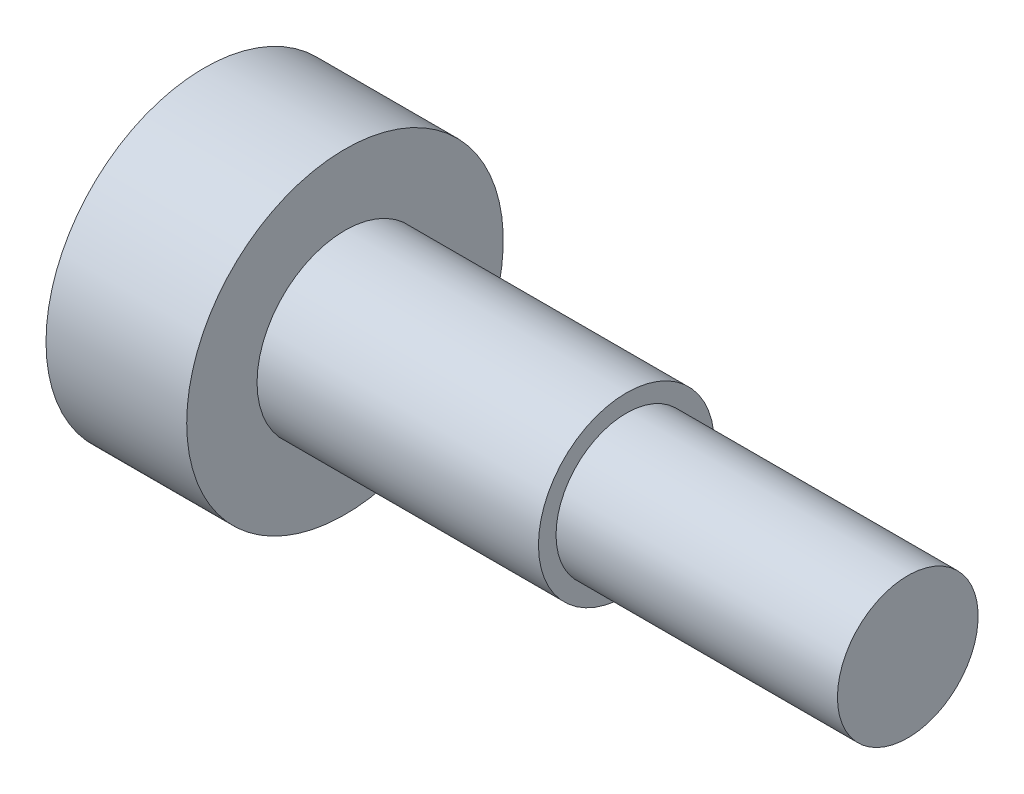
ISO-10303-21;
HEADER;
FILE_DESCRIPTION(('STEP AP214'),'2;1');
FILE_NAME('part.step','',(''),(''),'','','');
FILE_SCHEMA(('AUTOMOTIVE_DESIGN { 1 0 10303 214 1 1 1 1 }'));
ENDSEC;
DATA;
#1=APPLICATION_CONTEXT('core data for automotive mechanical design processes');
#2=APPLICATION_PROTOCOL_DEFINITION('international standard','automotive_design',2000,#1);
#3=PRODUCT_CONTEXT('',#1,'mechanical');
#4=PRODUCT('Part','Part','',(#3));
#5=PRODUCT_RELATED_PRODUCT_CATEGORY('part','',(#4));
#6=PRODUCT_DEFINITION_FORMATION('','',#4);
#7=PRODUCT_DEFINITION_CONTEXT('part definition',#1,'design');
#8=PRODUCT_DEFINITION('design','',#6,#7);
#9=PRODUCT_DEFINITION_SHAPE('','',#8);
#10=(LENGTH_UNIT() NAMED_UNIT(*) SI_UNIT(.MILLI.,.METRE.));
#11=(NAMED_UNIT(*) PLANE_ANGLE_UNIT() SI_UNIT($,.RADIAN.));
#12=(NAMED_UNIT(*) SI_UNIT($,.STERADIAN.) SOLID_ANGLE_UNIT());
#13=UNCERTAINTY_MEASURE_WITH_UNIT(LENGTH_MEASURE(1.E-05),#10,'distance_accuracy_value','');
#14=(GEOMETRIC_REPRESENTATION_CONTEXT(3) GLOBAL_UNCERTAINTY_ASSIGNED_CONTEXT((#13)) GLOBAL_UNIT_ASSIGNED_CONTEXT((#10,
#11,#12)) REPRESENTATION_CONTEXT('',''));
#15=CARTESIAN_POINT('',(0.,0.,0.));
#16=DIRECTION('',(0.,0.,1.));
#17=DIRECTION('',(1.,0.,0.));
#18=AXIS2_PLACEMENT_3D('',#15,#16,#17);
#19=CARTESIAN_POINT('',(4.,4.5,0.));
#20=DIRECTION('',(-1.,0.,0.));
#21=DIRECTION('',(0.,0.,1.));
#22=AXIS2_PLACEMENT_3D('',#19,#20,#21);
#23=PLANE('',#22);
#24=CARTESIAN_POINT('',(4.,0.,0.));
#25=DIRECTION('',(-1.,0.,0.));
#26=DIRECTION('',(0.,0.,1.));
#27=AXIS2_PLACEMENT_3D('',#24,#25,#26);
#28=CIRCLE('',#27,4.5);
#29=CARTESIAN_POINT('',(4.,0.,4.5));
#30=VERTEX_POINT('',#29);
#31=EDGE_CURVE('E150',#30,#30,#28,.T.);
#32=ORIENTED_EDGE('',*,*,#31,.F.);
#33=EDGE_LOOP('',(#32));
#34=FACE_BOUND('',#33,.T.);
#35=CARTESIAN_POINT('',(4.,0.,0.));
#36=DIRECTION('',(-1.,0.,0.));
#37=DIRECTION('',(0.,0.,1.));
#38=AXIS2_PLACEMENT_3D('',#35,#36,#37);
#39=CIRCLE('',#38,2.5);
#40=CARTESIAN_POINT('',(4.,0.,2.5));
#41=VERTEX_POINT('',#40);
#42=EDGE_CURVE('E11',#41,#41,#39,.T.);
#43=ORIENTED_EDGE('',*,*,#42,.T.);
#44=EDGE_LOOP('',(#43));
#45=FACE_BOUND('',#44,.T.);
#46=ADVANCED_FACE('F49',(#34,#45),#23,.F.);
#47=CARTESIAN_POINT('',(-20.,0.,0.));
#48=DIRECTION('',(-1.,0.,0.));
#49=DIRECTION('',(0.,0.,1.));
#50=AXIS2_PLACEMENT_3D('',#47,#48,#49);
#51=CYLINDRICAL_SURFACE('',#50,2.5);
#52=ORIENTED_EDGE('',*,*,#42,.F.);
#53=EDGE_LOOP('',(#52));
#54=FACE_BOUND('',#53,.T.);
#55=CARTESIAN_POINT('',(12.,0.,0.));
#56=DIRECTION('',(-1.,0.,0.));
#57=DIRECTION('',(0.,0.,1.));
#58=AXIS2_PLACEMENT_3D('',#55,#56,#57);
#59=CIRCLE('',#58,2.5);
#60=CARTESIAN_POINT('',(12.,0.,2.5));
#61=VERTEX_POINT('',#60);
#62=EDGE_CURVE('E56',#61,#61,#59,.T.);
#63=ORIENTED_EDGE('',*,*,#62,.T.);
#64=EDGE_LOOP('',(#63));
#65=FACE_BOUND('',#64,.T.);
#66=ADVANCED_FACE('F169',(#54,#65),#51,.T.);
#67=CARTESIAN_POINT('',(12.,2.5,0.));
#68=DIRECTION('',(-1.,0.,0.));
#69=DIRECTION('',(0.,0.,1.));
#70=AXIS2_PLACEMENT_3D('',#67,#68,#69);
#71=PLANE('',#70);
#72=ORIENTED_EDGE('',*,*,#62,.F.);
#73=EDGE_LOOP('',(#72));
#74=FACE_BOUND('',#73,.T.);
#75=CARTESIAN_POINT('',(12.,0.,0.));
#76=DIRECTION('',(-1.,0.,0.));
#77=DIRECTION('',(0.,0.,1.));
#78=AXIS2_PLACEMENT_3D('',#75,#76,#77);
#79=CIRCLE('',#78,2.);
#80=CARTESIAN_POINT('',(12.,0.,2.));
#81=VERTEX_POINT('',#80);
#82=EDGE_CURVE('E164',#81,#81,#79,.T.);
#83=ORIENTED_EDGE('',*,*,#82,.T.);
#84=EDGE_LOOP('',(#83));
#85=FACE_BOUND('',#84,.T.);
#86=ADVANCED_FACE('F171',(#74,#85),#71,.F.);
#87=CARTESIAN_POINT('',(-20.,0.,0.));
#88=DIRECTION('',(-1.,0.,0.));
#89=DIRECTION('',(0.,0.,1.));
#90=AXIS2_PLACEMENT_3D('',#87,#88,#89);
#91=CYLINDRICAL_SURFACE('',#90,2.);
#92=ORIENTED_EDGE('',*,*,#82,.F.);
#93=EDGE_LOOP('',(#92));
#94=FACE_BOUND('',#93,.T.);
#95=CARTESIAN_POINT('',(20.,0.,0.));
#96=DIRECTION('',(-1.,0.,0.));
#97=DIRECTION('',(0.,0.,1.));
#98=AXIS2_PLACEMENT_3D('',#95,#96,#97);
#99=CIRCLE('',#98,2.);
#100=CARTESIAN_POINT('',(20.,0.,2.));
#101=VERTEX_POINT('',#100);
#102=EDGE_CURVE('E161',#101,#101,#99,.T.);
#103=ORIENTED_EDGE('',*,*,#102,.T.);
#104=EDGE_LOOP('',(#103));
#105=FACE_BOUND('',#104,.T.);
#106=ADVANCED_FACE('F174',(#94,#105),#91,.T.);
#107=CARTESIAN_POINT('',(20.,2.,0.));
#108=DIRECTION('',(-1.,0.,0.));
#109=DIRECTION('',(0.,0.,1.));
#110=AXIS2_PLACEMENT_3D('',#107,#108,#109);
#111=PLANE('',#110);
#112=ORIENTED_EDGE('',*,*,#102,.F.);
#113=EDGE_LOOP('',(#112));
#114=FACE_BOUND('',#113,.T.);
#115=ADVANCED_FACE('F180',(#114),#111,.F.);
#116=CARTESIAN_POINT('',(0.,0.,0.));
#117=DIRECTION('',(1.,0.,0.));
#118=DIRECTION('',(0.,0.,-1.));
#119=AXIS2_PLACEMENT_3D('',#116,#117,#118);
#120=PLANE('',#119);
#121=DIRECTION('',(0.,0.866025403784438,-0.5));
#122=VECTOR('',#121,1.);
#123=CARTESIAN_POINT('',(0.,0.,1.44337567297406));
#124=LINE('',#123,#122);
#125=CARTESIAN_POINT('',(0.,0.,1.44337567297406));
#126=VERTEX_POINT('',#125);
#127=CARTESIAN_POINT('',(0.,1.25,0.721687836487031));
#128=VERTEX_POINT('',#127);
#129=EDGE_CURVE('E137',#126,#128,#124,.T.);
#130=ORIENTED_EDGE('',*,*,#129,.F.);
#131=DIRECTION('',(0.,0.866025403784439,0.499999999999999));
#132=VECTOR('',#131,1.);
#133=CARTESIAN_POINT('',(0.,-1.25,0.721687836487032));
#134=LINE('',#133,#132);
#135=CARTESIAN_POINT('',(0.,-1.25,0.721687836487032));
#136=VERTEX_POINT('',#135);
#137=EDGE_CURVE('E63',#136,#126,#134,.T.);
#138=ORIENTED_EDGE('',*,*,#137,.F.);
#139=DIRECTION('',(0.,0.,1.));
#140=VECTOR('',#139,1.);
#141=CARTESIAN_POINT('',(0.,-1.25,-0.721687836487033));
#142=LINE('',#141,#140);
#143=CARTESIAN_POINT('',(0.,-1.25,-0.721687836487033));
#144=VERTEX_POINT('',#143);
#145=EDGE_CURVE('E146',#144,#136,#142,.T.);
#146=ORIENTED_EDGE('',*,*,#145,.F.);
#147=DIRECTION('',(0.,-0.866025403784438,0.5));
#148=VECTOR('',#147,1.);
#149=CARTESIAN_POINT('',(0.,0.,-1.44337567297407));
#150=LINE('',#149,#148);
#151=CARTESIAN_POINT('',(0.,0.,-1.44337567297407));
#152=VERTEX_POINT('',#151);
#153=EDGE_CURVE('E144',#152,#144,#150,.T.);
#154=ORIENTED_EDGE('',*,*,#153,.F.);
#155=DIRECTION('',(0.,-0.866025403784439,-0.5));
#156=VECTOR('',#155,1.);
#157=CARTESIAN_POINT('',(0.,1.25,-0.721687836487033));
#158=LINE('',#157,#156);
#159=CARTESIAN_POINT('',(0.,1.25,-0.721687836487033));
#160=VERTEX_POINT('',#159);
#161=EDGE_CURVE('E111',#160,#152,#158,.T.);
#162=ORIENTED_EDGE('',*,*,#161,.F.);
#163=DIRECTION('',(0.,0.,-1.));
#164=VECTOR('',#163,1.);
#165=CARTESIAN_POINT('',(0.,1.25,0.721687836487031));
#166=LINE('',#165,#164);
#167=EDGE_CURVE('E140',#128,#160,#166,.T.);
#168=ORIENTED_EDGE('',*,*,#167,.F.);
#169=EDGE_LOOP('',(#130,#138,#146,#154,#162,#168));
#170=FACE_BOUND('',#169,.T.);
#171=CARTESIAN_POINT('',(0.,0.,0.));
#172=DIRECTION('',(-1.,0.,0.));
#173=DIRECTION('',(0.,0.,1.));
#174=AXIS2_PLACEMENT_3D('',#171,#172,#173);
#175=CIRCLE('',#174,4.5);
#176=CARTESIAN_POINT('',(0.,0.,4.5));
#177=VERTEX_POINT('',#176);
#178=EDGE_CURVE('E158',#177,#177,#175,.T.);
#179=ORIENTED_EDGE('',*,*,#178,.T.);
#180=EDGE_LOOP('',(#179));
#181=FACE_BOUND('',#180,.T.);
#182=ADVANCED_FACE('F185',(#170,#181),#120,.F.);
#183=CARTESIAN_POINT('',(-20.,0.,0.));
#184=DIRECTION('',(-1.,0.,0.));
#185=DIRECTION('',(0.,0.,1.));
#186=AXIS2_PLACEMENT_3D('',#183,#184,#185);
#187=CYLINDRICAL_SURFACE('',#186,4.5);
#188=ORIENTED_EDGE('',*,*,#178,.F.);
#189=EDGE_LOOP('',(#188));
#190=FACE_BOUND('',#189,.T.);
#191=ORIENTED_EDGE('',*,*,#31,.T.);
#192=EDGE_LOOP('',(#191));
#193=FACE_BOUND('',#192,.T.);
#194=ADVANCED_FACE('F192',(#190,#193),#187,.T.);
#195=CARTESIAN_POINT('',(2.5,-1.25,0.721687836487032));
#196=DIRECTION('',(0.,-0.5,0.866025403784439));
#197=DIRECTION('',(0.,-0.866025403784439,-0.5));
#198=AXIS2_PLACEMENT_3D('',#195,#196,#197);
#199=PLANE('',#198);
#200=ORIENTED_EDGE('',*,*,#137,.T.);
#201=DIRECTION('',(-1.,0.,0.));
#202=VECTOR('',#201,1.);
#203=CARTESIAN_POINT('',(2.5,0.,1.44337567297406));
#204=LINE('',#203,#202);
#205=CARTESIAN_POINT('',(2.5,0.,1.44337567297406));
#206=VERTEX_POINT('',#205);
#207=EDGE_CURVE('E93',#206,#126,#204,.T.);
#208=ORIENTED_EDGE('',*,*,#207,.F.);
#209=DIRECTION('',(0.,0.866025403784439,0.499999999999999));
#210=VECTOR('',#209,1.);
#211=CARTESIAN_POINT('',(2.5,-1.25,0.721687836487032));
#212=LINE('',#211,#210);
#213=CARTESIAN_POINT('',(2.5,-1.25,0.721687836487032));
#214=VERTEX_POINT('',#213);
#215=EDGE_CURVE('E148',#214,#206,#212,.T.);
#216=ORIENTED_EDGE('',*,*,#215,.F.);
#217=DIRECTION('',(-1.,0.,0.));
#218=VECTOR('',#217,1.);
#219=CARTESIAN_POINT('',(2.5,-1.25,0.721687836487032));
#220=LINE('',#219,#218);
#221=EDGE_CURVE('E71',#214,#136,#220,.T.);
#222=ORIENTED_EDGE('',*,*,#221,.T.);
#223=EDGE_LOOP('',(#200,#208,#216,#222));
#224=FACE_BOUND('',#223,.T.);
#225=ADVANCED_FACE('F206',(#224),#199,.F.);
#226=CARTESIAN_POINT('',(2.5,-1.25,-0.721687836487033));
#227=DIRECTION('',(0.,-1.,0.));
#228=DIRECTION('',(0.,0.,-1.));
#229=AXIS2_PLACEMENT_3D('',#226,#227,#228);
#230=PLANE('',#229);
#231=ORIENTED_EDGE('',*,*,#145,.T.);
#232=ORIENTED_EDGE('',*,*,#221,.F.);
#233=DIRECTION('',(0.,0.,1.));
#234=VECTOR('',#233,1.);
#235=CARTESIAN_POINT('',(2.5,-1.25,-0.721687836487033));
#236=LINE('',#235,#234);
#237=CARTESIAN_POINT('',(2.5,-1.25,-0.721687836487033));
#238=VERTEX_POINT('',#237);
#239=EDGE_CURVE('E123',#238,#214,#236,.T.);
#240=ORIENTED_EDGE('',*,*,#239,.F.);
#241=DIRECTION('',(-1.,0.,0.));
#242=VECTOR('',#241,1.);
#243=CARTESIAN_POINT('',(2.5,-1.25,-0.721687836487033));
#244=LINE('',#243,#242);
#245=EDGE_CURVE('E115',#238,#144,#244,.T.);
#246=ORIENTED_EDGE('',*,*,#245,.T.);
#247=EDGE_LOOP('',(#231,#232,#240,#246));
#248=FACE_BOUND('',#247,.T.);
#249=ADVANCED_FACE('F212',(#248),#230,.F.);
#250=CARTESIAN_POINT('',(2.5,0.,-1.44337567297407));
#251=DIRECTION('',(0.,-0.5,-0.866025403784439));
#252=DIRECTION('',(0.,0.866025403784439,-0.5));
#253=AXIS2_PLACEMENT_3D('',#250,#251,#252);
#254=PLANE('',#253);
#255=ORIENTED_EDGE('',*,*,#153,.T.);
#256=ORIENTED_EDGE('',*,*,#245,.F.);
#257=DIRECTION('',(0.,-0.866025403784438,0.5));
#258=VECTOR('',#257,1.);
#259=CARTESIAN_POINT('',(2.5,0.,-1.44337567297407));
#260=LINE('',#259,#258);
#261=CARTESIAN_POINT('',(2.5,0.,-1.44337567297407));
#262=VERTEX_POINT('',#261);
#263=EDGE_CURVE('E119',#262,#238,#260,.T.);
#264=ORIENTED_EDGE('',*,*,#263,.F.);
#265=DIRECTION('',(-1.,0.,0.));
#266=VECTOR('',#265,1.);
#267=CARTESIAN_POINT('',(2.5,0.,-1.44337567297407));
#268=LINE('',#267,#266);
#269=EDGE_CURVE('E104',#262,#152,#268,.T.);
#270=ORIENTED_EDGE('',*,*,#269,.T.);
#271=EDGE_LOOP('',(#255,#256,#264,#270));
#272=FACE_BOUND('',#271,.T.);
#273=ADVANCED_FACE('F120',(#272),#254,.F.);
#274=CARTESIAN_POINT('',(2.5,1.25,-0.721687836487033));
#275=DIRECTION('',(0.,0.5,-0.866025403784439));
#276=DIRECTION('',(0.,0.866025403784439,0.5));
#277=AXIS2_PLACEMENT_3D('',#274,#275,#276);
#278=PLANE('',#277);
#279=ORIENTED_EDGE('',*,*,#161,.T.);
#280=ORIENTED_EDGE('',*,*,#269,.F.);
#281=DIRECTION('',(0.,-0.866025403784439,-0.5));
#282=VECTOR('',#281,1.);
#283=CARTESIAN_POINT('',(2.5,1.25,-0.721687836487033));
#284=LINE('',#283,#282);
#285=CARTESIAN_POINT('',(2.5,1.25,-0.721687836487033));
#286=VERTEX_POINT('',#285);
#287=EDGE_CURVE('E108',#286,#262,#284,.T.);
#288=ORIENTED_EDGE('',*,*,#287,.F.);
#289=DIRECTION('',(-1.,0.,0.));
#290=VECTOR('',#289,1.);
#291=CARTESIAN_POINT('',(2.5,1.25,-0.721687836487033));
#292=LINE('',#291,#290);
#293=EDGE_CURVE('E116',#286,#160,#292,.T.);
#294=ORIENTED_EDGE('',*,*,#293,.T.);
#295=EDGE_LOOP('',(#279,#280,#288,#294));
#296=FACE_BOUND('',#295,.T.);
#297=ADVANCED_FACE('F106',(#296),#278,.F.);
#298=CARTESIAN_POINT('',(2.5,1.25,0.721687836487031));
#299=DIRECTION('',(0.,1.,0.));
#300=DIRECTION('',(0.,0.,1.));
#301=AXIS2_PLACEMENT_3D('',#298,#299,#300);
#302=PLANE('',#301);
#303=ORIENTED_EDGE('',*,*,#167,.T.);
#304=ORIENTED_EDGE('',*,*,#293,.F.);
#305=DIRECTION('',(0.,0.,-1.));
#306=VECTOR('',#305,1.);
#307=CARTESIAN_POINT('',(2.5,1.25,0.721687836487031));
#308=LINE('',#307,#306);
#309=CARTESIAN_POINT('',(2.5,1.25,0.721687836487031));
#310=VERTEX_POINT('',#309);
#311=EDGE_CURVE('E129',#310,#286,#308,.T.);
#312=ORIENTED_EDGE('',*,*,#311,.F.);
#313=DIRECTION('',(-1.,0.,0.));
#314=VECTOR('',#313,1.);
#315=CARTESIAN_POINT('',(2.5,1.25,0.721687836487031));
#316=LINE('',#315,#314);
#317=EDGE_CURVE('E153',#310,#128,#316,.T.);
#318=ORIENTED_EDGE('',*,*,#317,.T.);
#319=EDGE_LOOP('',(#303,#304,#312,#318));
#320=FACE_BOUND('',#319,.T.);
#321=ADVANCED_FACE('F219',(#320),#302,.F.);
#322=CARTESIAN_POINT('',(2.5,0.,1.44337567297406));
#323=DIRECTION('',(0.,0.5,0.866025403784439));
#324=DIRECTION('',(0.,-0.866025403784439,0.5));
#325=AXIS2_PLACEMENT_3D('',#322,#323,#324);
#326=PLANE('',#325);
#327=ORIENTED_EDGE('',*,*,#129,.T.);
#328=ORIENTED_EDGE('',*,*,#317,.F.);
#329=DIRECTION('',(0.,0.866025403784438,-0.5));
#330=VECTOR('',#329,1.);
#331=CARTESIAN_POINT('',(2.5,0.,1.44337567297406));
#332=LINE('',#331,#330);
#333=EDGE_CURVE('E131',#206,#310,#332,.T.);
#334=ORIENTED_EDGE('',*,*,#333,.F.);
#335=ORIENTED_EDGE('',*,*,#207,.T.);
#336=EDGE_LOOP('',(#327,#328,#334,#335));
#337=FACE_BOUND('',#336,.T.);
#338=ADVANCED_FACE('F216',(#337),#326,.F.);
#339=CARTESIAN_POINT('',(2.5,0.,0.));
#340=DIRECTION('',(-1.,0.,0.));
#341=DIRECTION('',(0.,0.,1.));
#342=AXIS2_PLACEMENT_3D('',#339,#340,#341);
#343=PLANE('',#342);
#344=ORIENTED_EDGE('',*,*,#215,.T.);
#345=ORIENTED_EDGE('',*,*,#333,.T.);
#346=ORIENTED_EDGE('',*,*,#311,.T.);
#347=ORIENTED_EDGE('',*,*,#287,.T.);
#348=ORIENTED_EDGE('',*,*,#263,.T.);
#349=ORIENTED_EDGE('',*,*,#239,.T.);
#350=EDGE_LOOP('',(#344,#345,#346,#347,#348,#349));
#351=FACE_BOUND('',#350,.T.);
#352=ADVANCED_FACE('F126',(#351),#343,.T.);
#353=CLOSED_SHELL('',(#46,#66,#86,#106,#115,#182,#194,#225,#249,#273,#297,#321,#338,#352));
#354=MANIFOLD_SOLID_BREP('B2',#353);
#355=ADVANCED_BREP_SHAPE_REPRESENTATION('',(#18,#354),#14);
#356=SHAPE_DEFINITION_REPRESENTATION(#9,#355);
ENDSEC;
END-ISO-10303-21;
